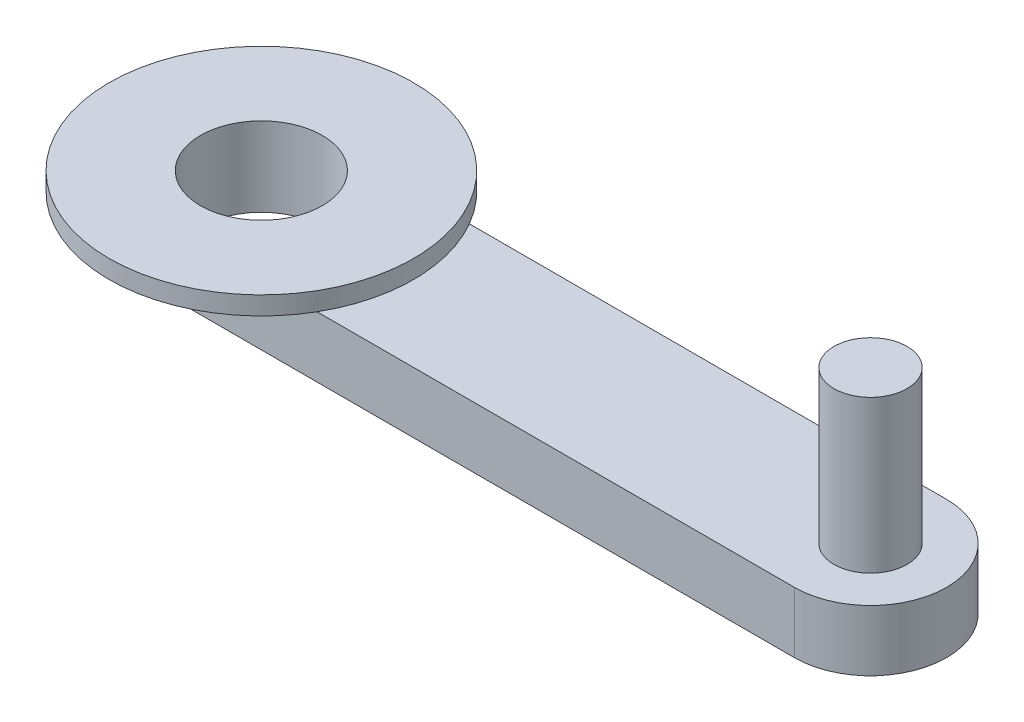
ISO-10303-21;
HEADER;
FILE_DESCRIPTION(('STEP AP214'),'2;1');
FILE_NAME('part.step','',(''),(''),'','','');
FILE_SCHEMA(('AUTOMOTIVE_DESIGN { 1 0 10303 214 1 1 1 1 }'));
ENDSEC;
DATA;
#1=APPLICATION_CONTEXT('core data for automotive mechanical design processes');
#2=APPLICATION_PROTOCOL_DEFINITION('international standard','automotive_design',2000,#1);
#3=PRODUCT_CONTEXT('',#1,'mechanical');
#4=PRODUCT('Part','Part','',(#3));
#5=PRODUCT_RELATED_PRODUCT_CATEGORY('part','',(#4));
#6=PRODUCT_DEFINITION_FORMATION('','',#4);
#7=PRODUCT_DEFINITION_CONTEXT('part definition',#1,'design');
#8=PRODUCT_DEFINITION('design','',#6,#7);
#9=PRODUCT_DEFINITION_SHAPE('','',#8);
#10=(LENGTH_UNIT() NAMED_UNIT(*) SI_UNIT(.MILLI.,.METRE.));
#11=(NAMED_UNIT(*) PLANE_ANGLE_UNIT() SI_UNIT($,.RADIAN.));
#12=(NAMED_UNIT(*) SI_UNIT($,.STERADIAN.) SOLID_ANGLE_UNIT());
#13=UNCERTAINTY_MEASURE_WITH_UNIT(LENGTH_MEASURE(1.E-05),#10,'distance_accuracy_value','');
#14=(GEOMETRIC_REPRESENTATION_CONTEXT(3) GLOBAL_UNCERTAINTY_ASSIGNED_CONTEXT((#13)) GLOBAL_UNIT_ASSIGNED_CONTEXT((#10,
#11,#12)) REPRESENTATION_CONTEXT('',''));
#15=CARTESIAN_POINT('',(0.,0.,0.));
#16=DIRECTION('',(0.,0.,1.));
#17=DIRECTION('',(1.,0.,0.));
#18=AXIS2_PLACEMENT_3D('',#15,#16,#17);
#19=CARTESIAN_POINT('',(0.,2.54,0.));
#20=DIRECTION('',(0.,1.,0.));
#21=DIRECTION('',(0.,0.,1.));
#22=AXIS2_PLACEMENT_3D('',#19,#20,#21);
#23=PLANE('',#22);
#24=CARTESIAN_POINT('',(0.,2.54,0.));
#25=DIRECTION('',(0.,1.,0.));
#26=DIRECTION('',(0.,0.,1.));
#27=AXIS2_PLACEMENT_3D('',#24,#25,#26);
#28=CIRCLE('',#27,1.524);
#29=CARTESIAN_POINT('',(0.,2.54,1.524));
#30=VERTEX_POINT('',#29);
#31=EDGE_CURVE('E118',#30,#30,#28,.T.);
#32=ORIENTED_EDGE('',*,*,#31,.F.);
#33=EDGE_LOOP('',(#32));
#34=FACE_BOUND('',#33,.T.);
#35=DIRECTION('',(-1.,0.,0.));
#36=VECTOR('',#35,1.);
#37=CARTESIAN_POINT('',(0.,2.54,-3.175));
#38=LINE('',#37,#36);
#39=CARTESIAN_POINT('',(0.,2.54,-3.175));
#40=VERTEX_POINT('',#39);
#41=CARTESIAN_POINT('',(-19.9007386859688,2.54,-3.175));
#42=VERTEX_POINT('',#41);
#43=EDGE_CURVE('E169',#40,#42,#38,.T.);
#44=ORIENTED_EDGE('',*,*,#43,.T.);
#45=CARTESIAN_POINT('',(-25.4,2.54,0.));
#46=DIRECTION('',(0.,1.,0.));
#47=DIRECTION('',(0.,0.,1.));
#48=AXIS2_PLACEMENT_3D('',#45,#46,#47);
#49=CIRCLE('',#48,6.35);
#50=CARTESIAN_POINT('',(-19.9007386859688,2.54,3.175));
#51=VERTEX_POINT('',#50);
#52=EDGE_CURVE('E147',#51,#42,#49,.T.);
#53=ORIENTED_EDGE('',*,*,#52,.F.);
#54=DIRECTION('',(1.,0.,0.));
#55=VECTOR('',#54,1.);
#56=CARTESIAN_POINT('',(0.,2.54,3.175));
#57=LINE('',#56,#55);
#58=CARTESIAN_POINT('',(0.,2.54,3.175));
#59=VERTEX_POINT('',#58);
#60=EDGE_CURVE('E67',#51,#59,#57,.T.);
#61=ORIENTED_EDGE('',*,*,#60,.T.);
#62=CARTESIAN_POINT('',(0.,2.54,0.));
#63=DIRECTION('',(0.,1.,0.));
#64=DIRECTION('',(0.,0.,1.));
#65=AXIS2_PLACEMENT_3D('',#62,#63,#64);
#66=CIRCLE('',#65,3.175);
#67=EDGE_CURVE('E99',#59,#40,#66,.T.);
#68=ORIENTED_EDGE('',*,*,#67,.T.);
#69=EDGE_LOOP('',(#44,#53,#61,#68));
#70=FACE_BOUND('',#69,.T.);
#71=ADVANCED_FACE('F43',(#34,#70),#23,.T.);
#72=CARTESIAN_POINT('',(0.,2.54,0.));
#73=DIRECTION('',(0.,-1.,0.));
#74=DIRECTION('',(0.,0.,-1.));
#75=AXIS2_PLACEMENT_3D('',#72,#73,#74);
#76=CYLINDRICAL_SURFACE('',#75,3.175);
#77=CARTESIAN_POINT('',(0.,0.,0.));
#78=DIRECTION('',(0.,1.,0.));
#79=DIRECTION('',(0.,0.,1.));
#80=AXIS2_PLACEMENT_3D('',#77,#78,#79);
#81=CIRCLE('',#80,3.175);
#82=CARTESIAN_POINT('',(0.,0.,3.175));
#83=VERTEX_POINT('',#82);
#84=CARTESIAN_POINT('',(0.,0.,-3.175));
#85=VERTEX_POINT('',#84);
#86=EDGE_CURVE('E105',#83,#85,#81,.T.);
#87=ORIENTED_EDGE('',*,*,#86,.T.);
#88=DIRECTION('',(0.,-1.,0.));
#89=VECTOR('',#88,1.);
#90=CARTESIAN_POINT('',(0.,2.54,-3.175));
#91=LINE('',#90,#89);
#92=EDGE_CURVE('E11',#40,#85,#91,.T.);
#93=ORIENTED_EDGE('',*,*,#92,.F.);
#94=ORIENTED_EDGE('',*,*,#67,.F.);
#95=DIRECTION('',(0.,-1.,0.));
#96=VECTOR('',#95,1.);
#97=CARTESIAN_POINT('',(0.,2.54,3.175));
#98=LINE('',#97,#96);
#99=EDGE_CURVE('E90',#59,#83,#98,.T.);
#100=ORIENTED_EDGE('',*,*,#99,.T.);
#101=EDGE_LOOP('',(#87,#93,#94,#100));
#102=FACE_BOUND('',#101,.T.);
#103=ADVANCED_FACE('F45',(#102),#76,.T.);
#104=CARTESIAN_POINT('',(0.,2.54,-3.175));
#105=DIRECTION('',(0.,0.,1.));
#106=DIRECTION('',(1.,0.,0.));
#107=AXIS2_PLACEMENT_3D('',#104,#105,#106);
#108=PLANE('',#107);
#109=DIRECTION('',(-1.,0.,0.));
#110=VECTOR('',#109,1.);
#111=CARTESIAN_POINT('',(0.,0.,-3.175));
#112=LINE('',#111,#110);
#113=CARTESIAN_POINT('',(-25.4,0.,-3.175));
#114=VERTEX_POINT('',#113);
#115=EDGE_CURVE('E110',#85,#114,#112,.T.);
#116=ORIENTED_EDGE('',*,*,#115,.T.);
#117=DIRECTION('',(0.,-1.,0.));
#118=VECTOR('',#117,1.);
#119=CARTESIAN_POINT('',(-25.4,2.54,-3.175));
#120=LINE('',#119,#118);
#121=CARTESIAN_POINT('',(-25.4,2.54,-3.175));
#122=VERTEX_POINT('',#121);
#123=EDGE_CURVE('E52',#122,#114,#120,.T.);
#124=ORIENTED_EDGE('',*,*,#123,.F.);
#125=DIRECTION('',(-1.,0.,0.));
#126=VECTOR('',#125,1.);
#127=CARTESIAN_POINT('',(0.,2.54,-3.175));
#128=LINE('',#127,#126);
#129=EDGE_CURVE('E139',#42,#122,#128,.T.);
#130=ORIENTED_EDGE('',*,*,#129,.F.);
#131=ORIENTED_EDGE('',*,*,#43,.F.);
#132=ORIENTED_EDGE('',*,*,#92,.T.);
#133=EDGE_LOOP('',(#116,#124,#130,#131,#132));
#134=FACE_BOUND('',#133,.T.);
#135=ADVANCED_FACE('F136',(#134),#108,.F.);
#136=CARTESIAN_POINT('',(-25.4,2.54,0.));
#137=DIRECTION('',(0.,-1.,0.));
#138=DIRECTION('',(0.,0.,-1.));
#139=AXIS2_PLACEMENT_3D('',#136,#137,#138);
#140=CYLINDRICAL_SURFACE('',#139,3.175);
#141=CARTESIAN_POINT('',(-25.4,0.,0.));
#142=DIRECTION('',(0.,1.,0.));
#143=DIRECTION('',(0.,0.,1.));
#144=AXIS2_PLACEMENT_3D('',#141,#142,#143);
#145=CIRCLE('',#144,3.175);
#146=CARTESIAN_POINT('',(-25.4,0.,3.175));
#147=VERTEX_POINT('',#146);
#148=EDGE_CURVE('E100',#114,#147,#145,.T.);
#149=ORIENTED_EDGE('',*,*,#148,.T.);
#150=DIRECTION('',(0.,-1.,0.));
#151=VECTOR('',#150,1.);
#152=CARTESIAN_POINT('',(-25.4,2.54,3.175));
#153=LINE('',#152,#151);
#154=CARTESIAN_POINT('',(-25.4,2.54,3.175));
#155=VERTEX_POINT('',#154);
#156=EDGE_CURVE('E94',#155,#147,#153,.T.);
#157=ORIENTED_EDGE('',*,*,#156,.F.);
#158=CARTESIAN_POINT('',(-25.4,2.54,0.));
#159=DIRECTION('',(0.,1.,0.));
#160=DIRECTION('',(0.,0.,1.));
#161=AXIS2_PLACEMENT_3D('',#158,#159,#160);
#162=CIRCLE('',#161,3.175);
#163=EDGE_CURVE('E133',#122,#155,#162,.T.);
#164=ORIENTED_EDGE('',*,*,#163,.F.);
#165=ORIENTED_EDGE('',*,*,#123,.T.);
#166=EDGE_LOOP('',(#149,#157,#164,#165));
#167=FACE_BOUND('',#166,.T.);
#168=ADVANCED_FACE('F131',(#167),#140,.T.);
#169=CARTESIAN_POINT('',(0.,2.54,3.175));
#170=DIRECTION('',(0.,0.,-1.));
#171=DIRECTION('',(-1.,0.,0.));
#172=AXIS2_PLACEMENT_3D('',#169,#170,#171);
#173=PLANE('',#172);
#174=DIRECTION('',(1.,0.,0.));
#175=VECTOR('',#174,1.);
#176=CARTESIAN_POINT('',(0.,0.,3.175));
#177=LINE('',#176,#175);
#178=EDGE_CURVE('E87',#147,#83,#177,.T.);
#179=ORIENTED_EDGE('',*,*,#178,.T.);
#180=ORIENTED_EDGE('',*,*,#99,.F.);
#181=ORIENTED_EDGE('',*,*,#60,.F.);
#182=EDGE_CURVE('E107',#155,#51,#57,.T.);
#183=ORIENTED_EDGE('',*,*,#182,.F.);
#184=ORIENTED_EDGE('',*,*,#156,.T.);
#185=EDGE_LOOP('',(#179,#180,#181,#183,#184));
#186=FACE_BOUND('',#185,.T.);
#187=ADVANCED_FACE('F89',(#186),#173,.F.);
#188=CARTESIAN_POINT('',(0.,0.,0.));
#189=DIRECTION('',(0.,1.,0.));
#190=DIRECTION('',(0.,0.,1.));
#191=AXIS2_PLACEMENT_3D('',#188,#189,#190);
#192=PLANE('',#191);
#193=CARTESIAN_POINT('',(-25.4,0.,0.));
#194=DIRECTION('',(0.,1.,0.));
#195=DIRECTION('',(0.,0.,1.));
#196=AXIS2_PLACEMENT_3D('',#193,#194,#195);
#197=CIRCLE('',#196,2.54);
#198=CARTESIAN_POINT('',(-25.4,0.,2.54000000000001));
#199=VERTEX_POINT('',#198);
#200=EDGE_CURVE('E160',#199,#199,#197,.T.);
#201=ORIENTED_EDGE('',*,*,#200,.T.);
#202=EDGE_LOOP('',(#201));
#203=FACE_BOUND('',#202,.T.);
#204=ORIENTED_EDGE('',*,*,#86,.F.);
#205=ORIENTED_EDGE('',*,*,#178,.F.);
#206=ORIENTED_EDGE('',*,*,#148,.F.);
#207=ORIENTED_EDGE('',*,*,#115,.F.);
#208=EDGE_LOOP('',(#204,#205,#206,#207));
#209=FACE_BOUND('',#208,.T.);
#210=ADVANCED_FACE('F109',(#203,#209),#192,.F.);
#211=CARTESIAN_POINT('',(0.,8.89,0.));
#212=DIRECTION('',(0.,-1.,0.));
#213=DIRECTION('',(0.,0.,-1.));
#214=AXIS2_PLACEMENT_3D('',#211,#212,#213);
#215=CYLINDRICAL_SURFACE('',#214,1.524);
#216=CARTESIAN_POINT('',(0.,8.89,0.));
#217=DIRECTION('',(0.,1.,0.));
#218=DIRECTION('',(0.,0.,1.));
#219=AXIS2_PLACEMENT_3D('',#216,#217,#218);
#220=CIRCLE('',#219,1.524);
#221=CARTESIAN_POINT('',(0.,8.89,1.524));
#222=VERTEX_POINT('',#221);
#223=EDGE_CURVE('E112',#222,#222,#220,.T.);
#224=ORIENTED_EDGE('',*,*,#223,.F.);
#225=EDGE_LOOP('',(#224));
#226=FACE_BOUND('',#225,.T.);
#227=ORIENTED_EDGE('',*,*,#31,.T.);
#228=EDGE_LOOP('',(#227));
#229=FACE_BOUND('',#228,.T.);
#230=ADVANCED_FACE('F185',(#226,#229),#215,.T.);
#231=CARTESIAN_POINT('',(0.,8.89,0.));
#232=DIRECTION('',(0.,1.,0.));
#233=DIRECTION('',(0.,0.,1.));
#234=AXIS2_PLACEMENT_3D('',#231,#232,#233);
#235=PLANE('',#234);
#236=ORIENTED_EDGE('',*,*,#223,.T.);
#237=EDGE_LOOP('',(#236));
#238=FACE_BOUND('',#237,.T.);
#239=ADVANCED_FACE('F211',(#238),#235,.T.);
#240=CARTESIAN_POINT('',(-25.4,0.,0.));
#241=DIRECTION('',(0.,1.,0.));
#242=DIRECTION('',(0.,0.,1.));
#243=AXIS2_PLACEMENT_3D('',#240,#241,#242);
#244=CYLINDRICAL_SURFACE('',#243,2.54);
#245=ORIENTED_EDGE('',*,*,#200,.F.);
#246=EDGE_LOOP('',(#245));
#247=FACE_BOUND('',#246,.T.);
#248=CARTESIAN_POINT('',(-25.4,3.302,0.));
#249=DIRECTION('',(0.,1.,0.));
#250=DIRECTION('',(0.,0.,1.));
#251=AXIS2_PLACEMENT_3D('',#248,#249,#250);
#252=CIRCLE('',#251,2.54);
#253=CARTESIAN_POINT('',(-25.4,3.302,2.54000000000001));
#254=VERTEX_POINT('',#253);
#255=EDGE_CURVE('E148',#254,#254,#252,.T.);
#256=ORIENTED_EDGE('',*,*,#255,.T.);
#257=EDGE_LOOP('',(#256));
#258=FACE_BOUND('',#257,.T.);
#259=ADVANCED_FACE('F206',(#247,#258),#244,.F.);
#260=CARTESIAN_POINT('',(-25.4,2.54,0.));
#261=DIRECTION('',(0.,1.,0.));
#262=DIRECTION('',(0.,0.,1.));
#263=AXIS2_PLACEMENT_3D('',#260,#261,#262);
#264=PLANE('',#263);
#265=EDGE_CURVE('E58',#42,#51,#49,.T.);
#266=ORIENTED_EDGE('',*,*,#265,.F.);
#267=ORIENTED_EDGE('',*,*,#129,.T.);
#268=ORIENTED_EDGE('',*,*,#163,.T.);
#269=ORIENTED_EDGE('',*,*,#182,.T.);
#270=EDGE_LOOP('',(#266,#267,#268,#269));
#271=FACE_BOUND('',#270,.T.);
#272=ADVANCED_FACE('F145',(#271),#264,.F.);
#273=CARTESIAN_POINT('',(-25.4,3.302,0.));
#274=DIRECTION('',(0.,1.,0.));
#275=DIRECTION('',(0.,0.,1.));
#276=AXIS2_PLACEMENT_3D('',#273,#274,#275);
#277=PLANE('',#276);
#278=CARTESIAN_POINT('',(-25.4,3.302,0.));
#279=DIRECTION('',(0.,1.,0.));
#280=DIRECTION('',(0.,0.,1.));
#281=AXIS2_PLACEMENT_3D('',#278,#279,#280);
#282=CIRCLE('',#281,6.35);
#283=CARTESIAN_POINT('',(-25.4,3.302,6.35000000000001));
#284=VERTEX_POINT('',#283);
#285=EDGE_CURVE('E152',#284,#284,#282,.T.);
#286=ORIENTED_EDGE('',*,*,#285,.T.);
#287=EDGE_LOOP('',(#286));
#288=FACE_BOUND('',#287,.T.);
#289=ORIENTED_EDGE('',*,*,#255,.F.);
#290=EDGE_LOOP('',(#289));
#291=FACE_BOUND('',#290,.T.);
#292=ADVANCED_FACE('F224',(#288,#291),#277,.T.);
#293=CARTESIAN_POINT('',(-25.4,3.302,0.));
#294=DIRECTION('',(0.,-1.,0.));
#295=DIRECTION('',(0.,0.,-1.));
#296=AXIS2_PLACEMENT_3D('',#293,#294,#295);
#297=CYLINDRICAL_SURFACE('',#296,6.35);
#298=ORIENTED_EDGE('',*,*,#285,.F.);
#299=EDGE_LOOP('',(#298));
#300=FACE_BOUND('',#299,.T.);
#301=ORIENTED_EDGE('',*,*,#52,.T.);
#302=ORIENTED_EDGE('',*,*,#265,.T.);
#303=EDGE_LOOP('',(#301,#302));
#304=FACE_BOUND('',#303,.T.);
#305=ADVANCED_FACE('F150',(#300,#304),#297,.T.);
#306=CLOSED_SHELL('',(#71,#103,#135,#168,#187,#210,#230,#239,#259,#272,#292,#305));
#307=MANIFOLD_SOLID_BREP('B2',#306);
#308=ADVANCED_BREP_SHAPE_REPRESENTATION('',(#18,#307),#14);
#309=SHAPE_DEFINITION_REPRESENTATION(#9,#308);
ENDSEC;
END-ISO-10303-21;
